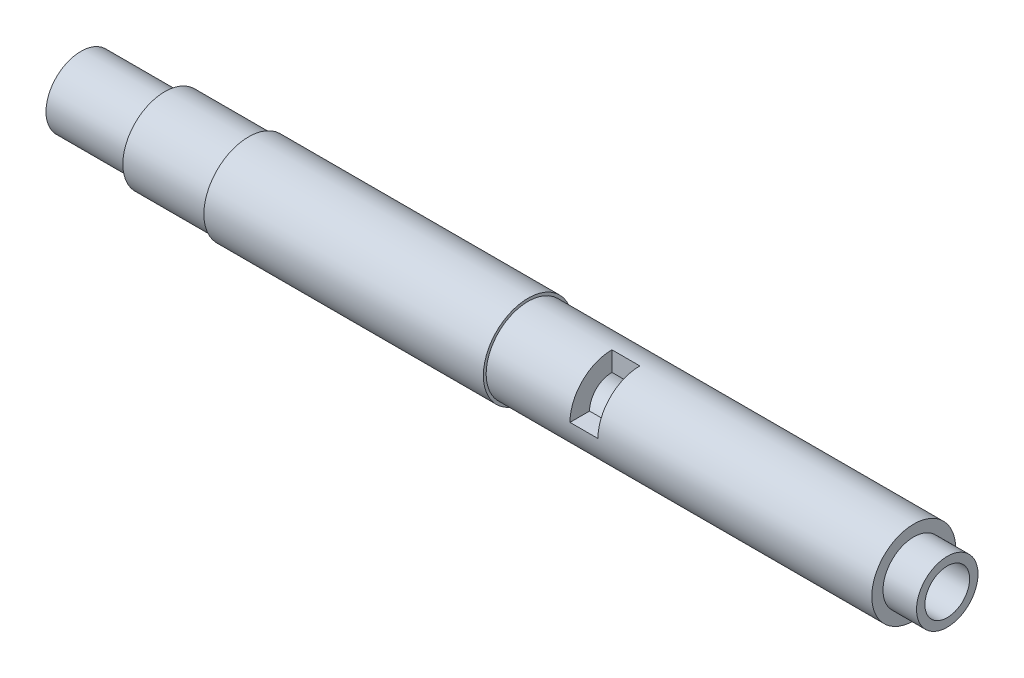
ISO-10303-21;
HEADER;
FILE_DESCRIPTION(('STEP AP214'),'2;1');
FILE_NAME('part.step','',(''),(''),'','','');
FILE_SCHEMA(('AUTOMOTIVE_DESIGN { 1 0 10303 214 1 1 1 1 }'));
ENDSEC;
DATA;
#1=APPLICATION_CONTEXT('core data for automotive mechanical design processes');
#2=APPLICATION_PROTOCOL_DEFINITION('international standard','automotive_design',2000,#1);
#3=PRODUCT_CONTEXT('',#1,'mechanical');
#4=PRODUCT('Part','Part','',(#3));
#5=PRODUCT_RELATED_PRODUCT_CATEGORY('part','',(#4));
#6=PRODUCT_DEFINITION_FORMATION('','',#4);
#7=PRODUCT_DEFINITION_CONTEXT('part definition',#1,'design');
#8=PRODUCT_DEFINITION('design','',#6,#7);
#9=PRODUCT_DEFINITION_SHAPE('','',#8);
#10=(LENGTH_UNIT() NAMED_UNIT(*) SI_UNIT(.MILLI.,.METRE.));
#11=(NAMED_UNIT(*) PLANE_ANGLE_UNIT() SI_UNIT($,.RADIAN.));
#12=(NAMED_UNIT(*) SI_UNIT($,.STERADIAN.) SOLID_ANGLE_UNIT());
#13=UNCERTAINTY_MEASURE_WITH_UNIT(LENGTH_MEASURE(1.E-05),#10,'distance_accuracy_value','');
#14=(GEOMETRIC_REPRESENTATION_CONTEXT(3) GLOBAL_UNCERTAINTY_ASSIGNED_CONTEXT((#13)) GLOBAL_UNIT_ASSIGNED_CONTEXT((#10,
#11,#12)) REPRESENTATION_CONTEXT('',''));
#15=CARTESIAN_POINT('',(0.,0.,0.));
#16=DIRECTION('',(0.,0.,1.));
#17=DIRECTION('',(1.,0.,0.));
#18=AXIS2_PLACEMENT_3D('',#15,#16,#17);
#19=CARTESIAN_POINT('',(220.,0.,0.));
#20=DIRECTION('',(-1.,0.,0.));
#21=DIRECTION('',(0.,0.,1.));
#22=AXIS2_PLACEMENT_3D('',#19,#20,#21);
#23=CYLINDRICAL_SURFACE('',#22,15.);
#24=CARTESIAN_POINT('',(160.,0.,0.));
#25=DIRECTION('',(-1.,0.,0.));
#26=DIRECTION('',(0.,0.,1.));
#27=AXIS2_PLACEMENT_3D('',#24,#25,#26);
#28=CIRCLE('',#27,15.);
#29=CARTESIAN_POINT('',(160.,0.,15.));
#30=VERTEX_POINT('',#29);
#31=EDGE_CURVE('E171',#30,#30,#28,.T.);
#32=ORIENTED_EDGE('',*,*,#31,.F.);
#33=EDGE_LOOP('',(#32));
#34=FACE_BOUND('',#33,.T.);
#35=CARTESIAN_POINT('',(190.,0.,0.));
#36=DIRECTION('',(1.,0.,0.));
#37=DIRECTION('',(0.,0.,1.));
#38=AXIS2_PLACEMENT_3D('',#35,#36,#37);
#39=CIRCLE('',#38,15.);
#40=CARTESIAN_POINT('',(190.,15.,0.));
#41=VERTEX_POINT('',#40);
#42=CARTESIAN_POINT('',(190.,0.,15.));
#43=VERTEX_POINT('',#42);
#44=EDGE_CURVE('E135',#41,#43,#39,.T.);
#45=ORIENTED_EDGE('',*,*,#44,.F.);
#46=DIRECTION('',(1.,0.,0.));
#47=VECTOR('',#46,1.);
#48=CARTESIAN_POINT('',(190.,15.,0.));
#49=LINE('',#48,#47);
#50=CARTESIAN_POINT('',(200.,15.,0.));
#51=VERTEX_POINT('',#50);
#52=EDGE_CURVE('E158',#41,#51,#49,.T.);
#53=ORIENTED_EDGE('',*,*,#52,.T.);
#54=CARTESIAN_POINT('',(200.,0.,0.));
#55=DIRECTION('',(1.,0.,0.));
#56=DIRECTION('',(0.,0.,1.));
#57=AXIS2_PLACEMENT_3D('',#54,#55,#56);
#58=CIRCLE('',#57,15.);
#59=CARTESIAN_POINT('',(200.,0.,15.));
#60=VERTEX_POINT('',#59);
#61=EDGE_CURVE('E147',#51,#60,#58,.T.);
#62=ORIENTED_EDGE('',*,*,#61,.T.);
#63=DIRECTION('',(1.,0.,0.));
#64=VECTOR('',#63,1.);
#65=CARTESIAN_POINT('',(190.,0.,15.));
#66=LINE('',#65,#64);
#67=EDGE_CURVE('E146',#43,#60,#66,.T.);
#68=ORIENTED_EDGE('',*,*,#67,.F.);
#69=EDGE_LOOP('',(#45,#53,#62,#68));
#70=FACE_BOUND('',#69,.T.);
#71=CARTESIAN_POINT('',(190.,0.,0.));
#72=DIRECTION('',(1.,0.,0.));
#73=DIRECTION('',(0.,0.,1.));
#74=AXIS2_PLACEMENT_3D('',#71,#72,#73);
#75=CIRCLE('',#74,15.);
#76=CARTESIAN_POINT('',(190.,-15.,0.));
#77=VERTEX_POINT('',#76);
#78=CARTESIAN_POINT('',(190.,0.,-15.));
#79=VERTEX_POINT('',#78);
#80=EDGE_CURVE('E117',#77,#79,#75,.T.);
#81=ORIENTED_EDGE('',*,*,#80,.F.);
#82=DIRECTION('',(1.,0.,0.));
#83=VECTOR('',#82,1.);
#84=CARTESIAN_POINT('',(190.,-15.,0.));
#85=LINE('',#84,#83);
#86=CARTESIAN_POINT('',(200.,-15.,0.));
#87=VERTEX_POINT('',#86);
#88=EDGE_CURVE('E151',#77,#87,#85,.T.);
#89=ORIENTED_EDGE('',*,*,#88,.T.);
#90=CARTESIAN_POINT('',(200.,0.,0.));
#91=DIRECTION('',(1.,0.,0.));
#92=DIRECTION('',(0.,0.,1.));
#93=AXIS2_PLACEMENT_3D('',#90,#91,#92);
#94=CIRCLE('',#93,15.);
#95=CARTESIAN_POINT('',(200.,0.,-15.));
#96=VERTEX_POINT('',#95);
#97=EDGE_CURVE('E128',#87,#96,#94,.T.);
#98=ORIENTED_EDGE('',*,*,#97,.T.);
#99=DIRECTION('',(1.,0.,0.));
#100=VECTOR('',#99,1.);
#101=CARTESIAN_POINT('',(190.,0.,-15.));
#102=LINE('',#101,#100);
#103=EDGE_CURVE('E110',#79,#96,#102,.T.);
#104=ORIENTED_EDGE('',*,*,#103,.F.);
#105=EDGE_LOOP('',(#81,#89,#98,#104));
#106=FACE_BOUND('',#105,.T.);
#107=CARTESIAN_POINT('',(298.,0.,0.));
#108=DIRECTION('',(1.,0.,0.));
#109=DIRECTION('',(0.,0.,-1.));
#110=AXIS2_PLACEMENT_3D('',#107,#108,#109);
#111=CIRCLE('',#110,15.);
#112=CARTESIAN_POINT('',(298.,0.,-15.));
#113=VERTEX_POINT('',#112);
#114=EDGE_CURVE('E264',#113,#113,#111,.T.);
#115=ORIENTED_EDGE('',*,*,#114,.F.);
#116=EDGE_LOOP('',(#115));
#117=FACE_BOUND('',#116,.T.);
#118=ADVANCED_FACE('F40',(#34,#70,#106,#117),#23,.T.);
#119=CARTESIAN_POINT('',(310.,0.,0.));
#120=DIRECTION('',(1.,0.,0.));
#121=DIRECTION('',(0.,0.,-1.));
#122=AXIS2_PLACEMENT_3D('',#119,#120,#121);
#123=PLANE('',#122);
#124=CARTESIAN_POINT('',(310.,0.,0.));
#125=DIRECTION('',(1.,0.,0.));
#126=DIRECTION('',(0.,0.,-1.));
#127=AXIS2_PLACEMENT_3D('',#124,#125,#126);
#128=CIRCLE('',#127,8.);
#129=CARTESIAN_POINT('',(310.,0.,-8.));
#130=VERTEX_POINT('',#129);
#131=EDGE_CURVE('E161',#130,#130,#128,.T.);
#132=ORIENTED_EDGE('',*,*,#131,.F.);
#133=EDGE_LOOP('',(#132));
#134=FACE_BOUND('',#133,.T.);
#135=CARTESIAN_POINT('',(310.,0.,0.));
#136=DIRECTION('',(1.,0.,0.));
#137=DIRECTION('',(0.,0.,-1.));
#138=AXIS2_PLACEMENT_3D('',#135,#136,#137);
#139=CIRCLE('',#138,11.);
#140=CARTESIAN_POINT('',(310.,0.,-11.));
#141=VERTEX_POINT('',#140);
#142=EDGE_CURVE('E259',#141,#141,#139,.T.);
#143=ORIENTED_EDGE('',*,*,#142,.T.);
#144=EDGE_LOOP('',(#143));
#145=FACE_BOUND('',#144,.T.);
#146=ADVANCED_FACE('F209',(#134,#145),#123,.T.);
#147=CARTESIAN_POINT('',(472.62741699797,0.,0.));
#148=DIRECTION('',(-1.,0.,0.));
#149=DIRECTION('',(0.,0.,1.));
#150=AXIS2_PLACEMENT_3D('',#147,#148,#149);
#151=CYLINDRICAL_SURFACE('',#150,8.);
#152=DIRECTION('',(1.,0.,0.));
#153=VECTOR('',#152,1.);
#154=CARTESIAN_POINT('',(190.,-8.,0.));
#155=LINE('',#154,#153);
#156=CARTESIAN_POINT('',(190.,-8.,0.));
#157=VERTEX_POINT('',#156);
#158=CARTESIAN_POINT('',(200.,-8.,0.));
#159=VERTEX_POINT('',#158);
#160=EDGE_CURVE('E130',#157,#159,#155,.T.);
#161=ORIENTED_EDGE('',*,*,#160,.F.);
#162=CARTESIAN_POINT('',(190.,0.,0.));
#163=DIRECTION('',(-1.,0.,0.));
#164=DIRECTION('',(0.,0.,1.));
#165=AXIS2_PLACEMENT_3D('',#162,#163,#164);
#166=CIRCLE('',#165,8.);
#167=CARTESIAN_POINT('',(190.,0.,-8.));
#168=VERTEX_POINT('',#167);
#169=EDGE_CURVE('E116',#168,#157,#166,.T.);
#170=ORIENTED_EDGE('',*,*,#169,.F.);
#171=DIRECTION('',(1.,0.,0.));
#172=VECTOR('',#171,1.);
#173=CARTESIAN_POINT('',(190.,0.,-8.));
#174=LINE('',#173,#172);
#175=CARTESIAN_POINT('',(200.,0.,-8.));
#176=VERTEX_POINT('',#175);
#177=EDGE_CURVE('E113',#168,#176,#174,.T.);
#178=ORIENTED_EDGE('',*,*,#177,.T.);
#179=CARTESIAN_POINT('',(200.,0.,0.));
#180=DIRECTION('',(-1.,0.,0.));
#181=DIRECTION('',(0.,0.,1.));
#182=AXIS2_PLACEMENT_3D('',#179,#180,#181);
#183=CIRCLE('',#182,8.);
#184=EDGE_CURVE('E273',#176,#159,#183,.T.);
#185=ORIENTED_EDGE('',*,*,#184,.T.);
#186=EDGE_LOOP('',(#161,#170,#178,#185));
#187=FACE_BOUND('',#186,.T.);
#188=DIRECTION('',(1.,0.,0.));
#189=VECTOR('',#188,1.);
#190=CARTESIAN_POINT('',(190.,8.,0.));
#191=LINE('',#190,#189);
#192=CARTESIAN_POINT('',(190.,8.,0.));
#193=VERTEX_POINT('',#192);
#194=CARTESIAN_POINT('',(200.,8.,0.));
#195=VERTEX_POINT('',#194);
#196=EDGE_CURVE('E162',#193,#195,#191,.T.);
#197=ORIENTED_EDGE('',*,*,#196,.F.);
#198=CARTESIAN_POINT('',(190.,0.,0.));
#199=DIRECTION('',(-1.,0.,0.));
#200=DIRECTION('',(0.,0.,1.));
#201=AXIS2_PLACEMENT_3D('',#198,#199,#200);
#202=CIRCLE('',#201,8.);
#203=CARTESIAN_POINT('',(190.,0.,8.));
#204=VERTEX_POINT('',#203);
#205=EDGE_CURVE('E141',#204,#193,#202,.T.);
#206=ORIENTED_EDGE('',*,*,#205,.F.);
#207=DIRECTION('',(1.,0.,0.));
#208=VECTOR('',#207,1.);
#209=CARTESIAN_POINT('',(190.,0.,8.));
#210=LINE('',#209,#208);
#211=CARTESIAN_POINT('',(200.,0.,8.));
#212=VERTEX_POINT('',#211);
#213=EDGE_CURVE('E164',#204,#212,#210,.T.);
#214=ORIENTED_EDGE('',*,*,#213,.T.);
#215=CARTESIAN_POINT('',(200.,0.,0.));
#216=DIRECTION('',(-1.,0.,0.));
#217=DIRECTION('',(0.,0.,1.));
#218=AXIS2_PLACEMENT_3D('',#215,#216,#217);
#219=CIRCLE('',#218,8.);
#220=EDGE_CURVE('E154',#212,#195,#219,.T.);
#221=ORIENTED_EDGE('',*,*,#220,.T.);
#222=EDGE_LOOP('',(#197,#206,#214,#221));
#223=FACE_BOUND('',#222,.T.);
#224=CARTESIAN_POINT('',(0.,0.,0.));
#225=DIRECTION('',(-1.,0.,0.));
#226=DIRECTION('',(0.,0.,1.));
#227=AXIS2_PLACEMENT_3D('',#224,#225,#226);
#228=CIRCLE('',#227,8.);
#229=CARTESIAN_POINT('',(0.,0.,8.));
#230=VERTEX_POINT('',#229);
#231=EDGE_CURVE('E11',#230,#230,#228,.T.);
#232=ORIENTED_EDGE('',*,*,#231,.T.);
#233=EDGE_LOOP('',(#232));
#234=FACE_BOUND('',#233,.T.);
#235=ORIENTED_EDGE('',*,*,#131,.T.);
#236=EDGE_LOOP('',(#235));
#237=FACE_BOUND('',#236,.T.);
#238=ADVANCED_FACE('F215',(#187,#223,#234,#237),#151,.F.);
#239=CARTESIAN_POINT('',(100.,0.,0.));
#240=DIRECTION('',(-1.,0.,0.));
#241=DIRECTION('',(0.,0.,1.));
#242=AXIS2_PLACEMENT_3D('',#239,#240,#241);
#243=CYLINDRICAL_SURFACE('',#242,16.);
#244=CARTESIAN_POINT('',(160.,0.,0.));
#245=DIRECTION('',(-1.,0.,0.));
#246=DIRECTION('',(0.,0.,1.));
#247=AXIS2_PLACEMENT_3D('',#244,#245,#246);
#248=CIRCLE('',#247,16.);
#249=CARTESIAN_POINT('',(160.,0.,16.));
#250=VERTEX_POINT('',#249);
#251=EDGE_CURVE('E174',#250,#250,#248,.T.);
#252=ORIENTED_EDGE('',*,*,#251,.T.);
#253=EDGE_LOOP('',(#252));
#254=FACE_BOUND('',#253,.T.);
#255=CARTESIAN_POINT('',(60.,0.,0.));
#256=DIRECTION('',(-1.,0.,0.));
#257=DIRECTION('',(0.,0.,1.));
#258=AXIS2_PLACEMENT_3D('',#255,#256,#257);
#259=CIRCLE('',#258,16.);
#260=CARTESIAN_POINT('',(60.,0.,16.));
#261=VERTEX_POINT('',#260);
#262=EDGE_CURVE('E181',#261,#261,#259,.T.);
#263=ORIENTED_EDGE('',*,*,#262,.F.);
#264=EDGE_LOOP('',(#263));
#265=FACE_BOUND('',#264,.T.);
#266=ADVANCED_FACE('F42',(#254,#265),#243,.T.);
#267=CARTESIAN_POINT('',(30.,0.,0.));
#268=DIRECTION('',(-1.,0.,0.));
#269=DIRECTION('',(0.,0.,1.));
#270=AXIS2_PLACEMENT_3D('',#267,#268,#269);
#271=PLANE('',#270);
#272=CARTESIAN_POINT('',(30.,0.,0.));
#273=DIRECTION('',(-1.,0.,0.));
#274=DIRECTION('',(0.,0.,1.));
#275=AXIS2_PLACEMENT_3D('',#272,#273,#274);
#276=CIRCLE('',#275,12.5);
#277=CARTESIAN_POINT('',(30.,0.,12.5));
#278=VERTEX_POINT('',#277);
#279=EDGE_CURVE('E48',#278,#278,#276,.T.);
#280=ORIENTED_EDGE('',*,*,#279,.F.);
#281=EDGE_LOOP('',(#280));
#282=FACE_BOUND('',#281,.T.);
#283=CARTESIAN_POINT('',(30.,0.,0.));
#284=DIRECTION('',(-1.,0.,0.));
#285=DIRECTION('',(0.,0.,1.));
#286=AXIS2_PLACEMENT_3D('',#283,#284,#285);
#287=CIRCLE('',#286,15.);
#288=CARTESIAN_POINT('',(30.,0.,15.));
#289=VERTEX_POINT('',#288);
#290=EDGE_CURVE('E177',#289,#289,#287,.T.);
#291=ORIENTED_EDGE('',*,*,#290,.T.);
#292=EDGE_LOOP('',(#291));
#293=FACE_BOUND('',#292,.T.);
#294=ADVANCED_FACE('F205',(#282,#293),#271,.T.);
#295=CARTESIAN_POINT('',(0.,0.,0.));
#296=DIRECTION('',(1.,0.,0.));
#297=DIRECTION('',(0.,0.,-1.));
#298=AXIS2_PLACEMENT_3D('',#295,#296,#297);
#299=PLANE('',#298);
#300=ORIENTED_EDGE('',*,*,#231,.F.);
#301=EDGE_LOOP('',(#300));
#302=FACE_BOUND('',#301,.T.);
#303=CARTESIAN_POINT('',(0.,0.,0.));
#304=DIRECTION('',(-1.,0.,0.));
#305=DIRECTION('',(0.,0.,1.));
#306=AXIS2_PLACEMENT_3D('',#303,#304,#305);
#307=CIRCLE('',#306,12.5);
#308=CARTESIAN_POINT('',(0.,0.,12.5));
#309=VERTEX_POINT('',#308);
#310=EDGE_CURVE('E186',#309,#309,#307,.T.);
#311=ORIENTED_EDGE('',*,*,#310,.T.);
#312=EDGE_LOOP('',(#311));
#313=FACE_BOUND('',#312,.T.);
#314=ADVANCED_FACE('F191',(#302,#313),#299,.F.);
#315=CARTESIAN_POINT('',(30.,0.,0.));
#316=DIRECTION('',(-1.,0.,0.));
#317=DIRECTION('',(0.,0.,1.));
#318=AXIS2_PLACEMENT_3D('',#315,#316,#317);
#319=CYLINDRICAL_SURFACE('',#318,12.5);
#320=ORIENTED_EDGE('',*,*,#279,.T.);
#321=EDGE_LOOP('',(#320));
#322=FACE_BOUND('',#321,.T.);
#323=ORIENTED_EDGE('',*,*,#310,.F.);
#324=EDGE_LOOP('',(#323));
#325=FACE_BOUND('',#324,.T.);
#326=ADVANCED_FACE('F193',(#322,#325),#319,.T.);
#327=CARTESIAN_POINT('',(60.,0.,0.));
#328=DIRECTION('',(-1.,0.,0.));
#329=DIRECTION('',(0.,0.,1.));
#330=AXIS2_PLACEMENT_3D('',#327,#328,#329);
#331=PLANE('',#330);
#332=CARTESIAN_POINT('',(60.,0.,0.));
#333=DIRECTION('',(-1.,0.,0.));
#334=DIRECTION('',(0.,0.,1.));
#335=AXIS2_PLACEMENT_3D('',#332,#333,#334);
#336=CIRCLE('',#335,15.);
#337=CARTESIAN_POINT('',(60.,0.,15.));
#338=VERTEX_POINT('',#337);
#339=EDGE_CURVE('E178',#338,#338,#336,.T.);
#340=ORIENTED_EDGE('',*,*,#339,.F.);
#341=EDGE_LOOP('',(#340));
#342=FACE_BOUND('',#341,.T.);
#343=ORIENTED_EDGE('',*,*,#262,.T.);
#344=EDGE_LOOP('',(#343));
#345=FACE_BOUND('',#344,.T.);
#346=ADVANCED_FACE('F195',(#342,#345),#331,.T.);
#347=CARTESIAN_POINT('',(60.,0.,0.));
#348=DIRECTION('',(-1.,0.,0.));
#349=DIRECTION('',(0.,0.,1.));
#350=AXIS2_PLACEMENT_3D('',#347,#348,#349);
#351=CYLINDRICAL_SURFACE('',#350,15.);
#352=ORIENTED_EDGE('',*,*,#339,.T.);
#353=EDGE_LOOP('',(#352));
#354=FACE_BOUND('',#353,.T.);
#355=ORIENTED_EDGE('',*,*,#290,.F.);
#356=EDGE_LOOP('',(#355));
#357=FACE_BOUND('',#356,.T.);
#358=ADVANCED_FACE('F202',(#354,#357),#351,.T.);
#359=CARTESIAN_POINT('',(160.,0.,0.));
#360=DIRECTION('',(-1.,0.,0.));
#361=DIRECTION('',(0.,0.,1.));
#362=AXIS2_PLACEMENT_3D('',#359,#360,#361);
#363=PLANE('',#362);
#364=ORIENTED_EDGE('',*,*,#31,.T.);
#365=EDGE_LOOP('',(#364));
#366=FACE_BOUND('',#365,.T.);
#367=ORIENTED_EDGE('',*,*,#251,.F.);
#368=EDGE_LOOP('',(#367));
#369=FACE_BOUND('',#368,.T.);
#370=ADVANCED_FACE('F222',(#366,#369),#363,.F.);
#371=CARTESIAN_POINT('',(190.,15.,0.));
#372=DIRECTION('',(0.,0.,-1.));
#373=DIRECTION('',(-1.,0.,0.));
#374=AXIS2_PLACEMENT_3D('',#371,#372,#373);
#375=PLANE('',#374);
#376=DIRECTION('',(0.,1.,0.));
#377=VECTOR('',#376,1.);
#378=CARTESIAN_POINT('',(200.,15.,0.));
#379=LINE('',#378,#377);
#380=EDGE_CURVE('E63',#195,#51,#379,.T.);
#381=ORIENTED_EDGE('',*,*,#380,.T.);
#382=ORIENTED_EDGE('',*,*,#52,.F.);
#383=DIRECTION('',(0.,1.,0.));
#384=VECTOR('',#383,1.);
#385=CARTESIAN_POINT('',(190.,15.,0.));
#386=LINE('',#385,#384);
#387=EDGE_CURVE('E143',#193,#41,#386,.T.);
#388=ORIENTED_EDGE('',*,*,#387,.F.);
#389=ORIENTED_EDGE('',*,*,#196,.T.);
#390=EDGE_LOOP('',(#381,#382,#388,#389));
#391=FACE_BOUND('',#390,.T.);
#392=ADVANCED_FACE('F225',(#391),#375,.F.);
#393=CARTESIAN_POINT('',(190.,0.,15.));
#394=DIRECTION('',(0.,-1.,0.));
#395=DIRECTION('',(0.,0.,-1.));
#396=AXIS2_PLACEMENT_3D('',#393,#394,#395);
#397=PLANE('',#396);
#398=DIRECTION('',(0.,0.,-1.));
#399=VECTOR('',#398,1.);
#400=CARTESIAN_POINT('',(200.,0.,15.));
#401=LINE('',#400,#399);
#402=EDGE_CURVE('E150',#60,#212,#401,.T.);
#403=ORIENTED_EDGE('',*,*,#402,.T.);
#404=ORIENTED_EDGE('',*,*,#213,.F.);
#405=DIRECTION('',(0.,0.,-1.));
#406=VECTOR('',#405,1.);
#407=CARTESIAN_POINT('',(190.,0.,15.));
#408=LINE('',#407,#406);
#409=EDGE_CURVE('E138',#43,#204,#408,.T.);
#410=ORIENTED_EDGE('',*,*,#409,.F.);
#411=ORIENTED_EDGE('',*,*,#67,.T.);
#412=EDGE_LOOP('',(#403,#404,#410,#411));
#413=FACE_BOUND('',#412,.T.);
#414=ADVANCED_FACE('F299',(#413),#397,.F.);
#415=CARTESIAN_POINT('',(190.,0.,0.));
#416=DIRECTION('',(-1.,0.,0.));
#417=DIRECTION('',(0.,0.,1.));
#418=AXIS2_PLACEMENT_3D('',#415,#416,#417);
#419=PLANE('',#418);
#420=ORIENTED_EDGE('',*,*,#44,.T.);
#421=ORIENTED_EDGE('',*,*,#409,.T.);
#422=ORIENTED_EDGE('',*,*,#205,.T.);
#423=ORIENTED_EDGE('',*,*,#387,.T.);
#424=EDGE_LOOP('',(#420,#421,#422,#423));
#425=FACE_BOUND('',#424,.T.);
#426=ADVANCED_FACE('F296',(#425),#419,.F.);
#427=CARTESIAN_POINT('',(200.,0.,0.));
#428=DIRECTION('',(-1.,0.,0.));
#429=DIRECTION('',(0.,0.,1.));
#430=AXIS2_PLACEMENT_3D('',#427,#428,#429);
#431=PLANE('',#430);
#432=ORIENTED_EDGE('',*,*,#61,.F.);
#433=ORIENTED_EDGE('',*,*,#380,.F.);
#434=ORIENTED_EDGE('',*,*,#220,.F.);
#435=ORIENTED_EDGE('',*,*,#402,.F.);
#436=EDGE_LOOP('',(#432,#433,#434,#435));
#437=FACE_BOUND('',#436,.T.);
#438=ADVANCED_FACE('F293',(#437),#431,.T.);
#439=CARTESIAN_POINT('',(190.,-8.,0.));
#440=DIRECTION('',(0.,0.,1.));
#441=DIRECTION('',(1.,0.,0.));
#442=AXIS2_PLACEMENT_3D('',#439,#440,#441);
#443=PLANE('',#442);
#444=DIRECTION('',(0.,-1.,0.));
#445=VECTOR('',#444,1.);
#446=CARTESIAN_POINT('',(200.,-8.,0.));
#447=LINE('',#446,#445);
#448=EDGE_CURVE('E55',#159,#87,#447,.T.);
#449=ORIENTED_EDGE('',*,*,#448,.T.);
#450=ORIENTED_EDGE('',*,*,#88,.F.);
#451=DIRECTION('',(0.,-1.,0.));
#452=VECTOR('',#451,1.);
#453=CARTESIAN_POINT('',(190.,-8.,0.));
#454=LINE('',#453,#452);
#455=EDGE_CURVE('E123',#157,#77,#454,.T.);
#456=ORIENTED_EDGE('',*,*,#455,.F.);
#457=ORIENTED_EDGE('',*,*,#160,.T.);
#458=EDGE_LOOP('',(#449,#450,#456,#457));
#459=FACE_BOUND('',#458,.T.);
#460=ADVANCED_FACE('F277',(#459),#443,.F.);
#461=CARTESIAN_POINT('',(190.,0.,-8.));
#462=DIRECTION('',(0.,1.,0.));
#463=DIRECTION('',(0.,0.,1.));
#464=AXIS2_PLACEMENT_3D('',#461,#462,#463);
#465=PLANE('',#464);
#466=DIRECTION('',(0.,0.,1.));
#467=VECTOR('',#466,1.);
#468=CARTESIAN_POINT('',(200.,0.,-8.));
#469=LINE('',#468,#467);
#470=EDGE_CURVE('E271',#96,#176,#469,.T.);
#471=ORIENTED_EDGE('',*,*,#470,.T.);
#472=ORIENTED_EDGE('',*,*,#177,.F.);
#473=DIRECTION('',(0.,0.,1.));
#474=VECTOR('',#473,1.);
#475=CARTESIAN_POINT('',(190.,0.,-8.));
#476=LINE('',#475,#474);
#477=EDGE_CURVE('E105',#79,#168,#476,.T.);
#478=ORIENTED_EDGE('',*,*,#477,.F.);
#479=ORIENTED_EDGE('',*,*,#103,.T.);
#480=EDGE_LOOP('',(#471,#472,#478,#479));
#481=FACE_BOUND('',#480,.T.);
#482=ADVANCED_FACE('F108',(#481),#465,.F.);
#483=CARTESIAN_POINT('',(190.,0.,0.));
#484=DIRECTION('',(-1.,0.,0.));
#485=DIRECTION('',(0.,0.,1.));
#486=AXIS2_PLACEMENT_3D('',#483,#484,#485);
#487=PLANE('',#486);
#488=ORIENTED_EDGE('',*,*,#80,.T.);
#489=ORIENTED_EDGE('',*,*,#477,.T.);
#490=ORIENTED_EDGE('',*,*,#169,.T.);
#491=ORIENTED_EDGE('',*,*,#455,.T.);
#492=EDGE_LOOP('',(#488,#489,#490,#491));
#493=FACE_BOUND('',#492,.T.);
#494=ADVANCED_FACE('F121',(#493),#487,.F.);
#495=CARTESIAN_POINT('',(200.,0.,0.));
#496=DIRECTION('',(-1.,0.,0.));
#497=DIRECTION('',(0.,0.,1.));
#498=AXIS2_PLACEMENT_3D('',#495,#496,#497);
#499=PLANE('',#498);
#500=ORIENTED_EDGE('',*,*,#97,.F.);
#501=ORIENTED_EDGE('',*,*,#448,.F.);
#502=ORIENTED_EDGE('',*,*,#184,.F.);
#503=ORIENTED_EDGE('',*,*,#470,.F.);
#504=EDGE_LOOP('',(#500,#501,#502,#503));
#505=FACE_BOUND('',#504,.T.);
#506=ADVANCED_FACE('F278',(#505),#499,.T.);
#507=CARTESIAN_POINT('',(298.,0.,0.));
#508=DIRECTION('',(1.,0.,0.));
#509=DIRECTION('',(0.,0.,-1.));
#510=AXIS2_PLACEMENT_3D('',#507,#508,#509);
#511=PLANE('',#510);
#512=CARTESIAN_POINT('',(298.,0.,0.));
#513=DIRECTION('',(1.,0.,0.));
#514=DIRECTION('',(0.,0.,-1.));
#515=AXIS2_PLACEMENT_3D('',#512,#513,#514);
#516=CIRCLE('',#515,11.);
#517=CARTESIAN_POINT('',(298.,0.,-11.));
#518=VERTEX_POINT('',#517);
#519=EDGE_CURVE('E261',#518,#518,#516,.T.);
#520=ORIENTED_EDGE('',*,*,#519,.F.);
#521=EDGE_LOOP('',(#520));
#522=FACE_BOUND('',#521,.T.);
#523=ORIENTED_EDGE('',*,*,#114,.T.);
#524=EDGE_LOOP('',(#523));
#525=FACE_BOUND('',#524,.T.);
#526=ADVANCED_FACE('F280',(#522,#525),#511,.T.);
#527=CARTESIAN_POINT('',(298.,0.,0.));
#528=DIRECTION('',(1.,0.,0.));
#529=DIRECTION('',(0.,0.,-1.));
#530=AXIS2_PLACEMENT_3D('',#527,#528,#529);
#531=CYLINDRICAL_SURFACE('',#530,11.);
#532=ORIENTED_EDGE('',*,*,#519,.T.);
#533=EDGE_LOOP('',(#532));
#534=FACE_BOUND('',#533,.T.);
#535=ORIENTED_EDGE('',*,*,#142,.F.);
#536=EDGE_LOOP('',(#535));
#537=FACE_BOUND('',#536,.T.);
#538=ADVANCED_FACE('F286',(#534,#537),#531,.T.);
#539=CLOSED_SHELL('',(#118,#146,#238,#266,#294,#314,#326,#346,#358,#370,#392,#414,#426,#438,
#460,#482,#494,#506,#526,#538));
#540=MANIFOLD_SOLID_BREP('B2',#539);
#541=ADVANCED_BREP_SHAPE_REPRESENTATION('',(#18,#540),#14);
#542=SHAPE_DEFINITION_REPRESENTATION(#9,#541);
ENDSEC;
END-ISO-10303-21;
